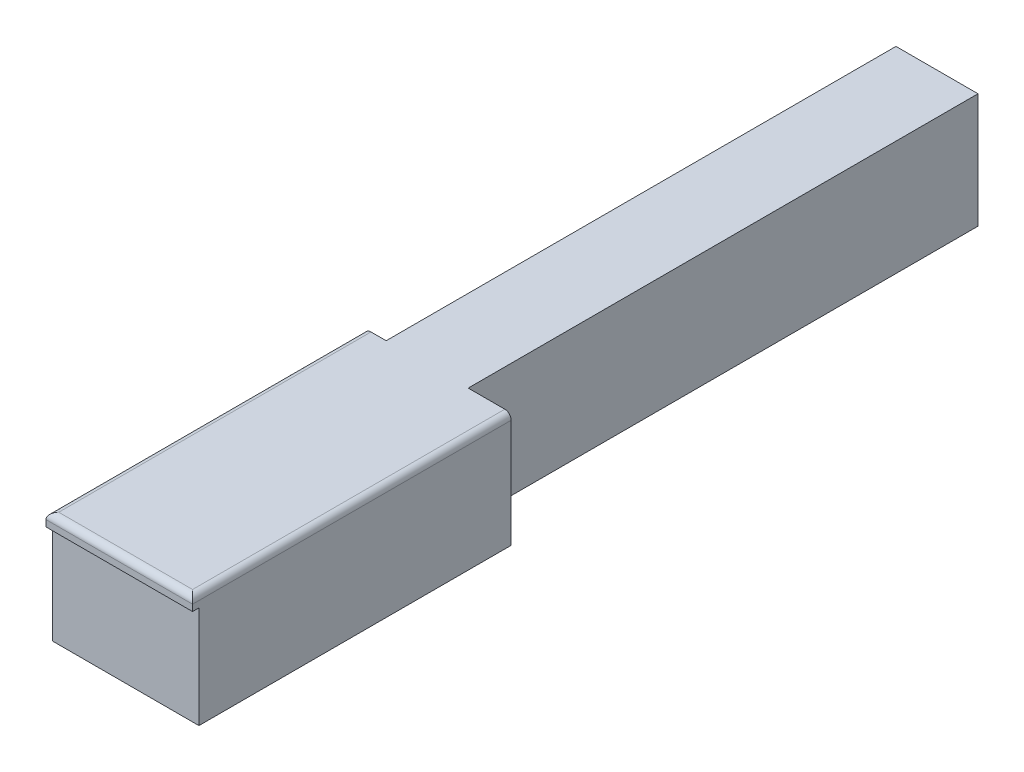
ISO-10303-21;
HEADER;
FILE_DESCRIPTION(('STEP AP214'),'2;1');
FILE_NAME('part.step','',(''),(''),'','','');
FILE_SCHEMA(('AUTOMOTIVE_DESIGN { 1 0 10303 214 1 1 1 1 }'));
ENDSEC;
DATA;
#1=APPLICATION_CONTEXT('core data for automotive mechanical design processes');
#2=APPLICATION_PROTOCOL_DEFINITION('international standard','automotive_design',2000,#1);
#3=PRODUCT_CONTEXT('',#1,'mechanical');
#4=PRODUCT('Part','Part','',(#3));
#5=PRODUCT_RELATED_PRODUCT_CATEGORY('part','',(#4));
#6=PRODUCT_DEFINITION_FORMATION('','',#4);
#7=PRODUCT_DEFINITION_CONTEXT('part definition',#1,'design');
#8=PRODUCT_DEFINITION('design','',#6,#7);
#9=PRODUCT_DEFINITION_SHAPE('','',#8);
#10=(LENGTH_UNIT() NAMED_UNIT(*) SI_UNIT(.MILLI.,.METRE.));
#11=(NAMED_UNIT(*) PLANE_ANGLE_UNIT() SI_UNIT($,.RADIAN.));
#12=(NAMED_UNIT(*) SI_UNIT($,.STERADIAN.) SOLID_ANGLE_UNIT());
#13=UNCERTAINTY_MEASURE_WITH_UNIT(LENGTH_MEASURE(1.E-05),#10,'distance_accuracy_value','');
#14=(GEOMETRIC_REPRESENTATION_CONTEXT(3) GLOBAL_UNCERTAINTY_ASSIGNED_CONTEXT((#13)) GLOBAL_UNIT_ASSIGNED_CONTEXT((#10,
#11,#12)) REPRESENTATION_CONTEXT('',''));
#15=CARTESIAN_POINT('',(0.,0.,0.));
#16=DIRECTION('',(0.,0.,1.));
#17=DIRECTION('',(1.,0.,0.));
#18=AXIS2_PLACEMENT_3D('',#15,#16,#17);
#19=CARTESIAN_POINT('',(0.,18.,-130.));
#20=DIRECTION('',(0.,0.,-1.));
#21=DIRECTION('',(-1.,0.,0.));
#22=AXIS2_PLACEMENT_3D('',#19,#20,#21);
#23=PLANE('',#22);
#24=DIRECTION('',(1.,0.,0.));
#25=VECTOR('',#24,1.);
#26=CARTESIAN_POINT('',(0.,0.,-130.));
#27=LINE('',#26,#25);
#28=CARTESIAN_POINT('',(3.38,0.,-130.));
#29=VERTEX_POINT('',#28);
#30=CARTESIAN_POINT('',(16.255,0.,-130.));
#31=VERTEX_POINT('',#30);
#32=EDGE_CURVE('E216',#29,#31,#27,.T.);
#33=ORIENTED_EDGE('',*,*,#32,.F.);
#34=DIRECTION('',(0.,-1.,0.));
#35=VECTOR('',#34,1.);
#36=CARTESIAN_POINT('',(3.38,18.,-130.));
#37=LINE('',#36,#35);
#38=CARTESIAN_POINT('',(3.38,18.,-130.));
#39=VERTEX_POINT('',#38);
#40=EDGE_CURVE('E181',#39,#29,#37,.T.);
#41=ORIENTED_EDGE('',*,*,#40,.F.);
#42=DIRECTION('',(1.,0.,0.));
#43=VECTOR('',#42,1.);
#44=CARTESIAN_POINT('',(0.,18.,-130.));
#45=LINE('',#44,#43);
#46=CARTESIAN_POINT('',(16.255,18.,-130.));
#47=VERTEX_POINT('',#46);
#48=EDGE_CURVE('E165',#39,#47,#45,.T.);
#49=ORIENTED_EDGE('',*,*,#48,.T.);
#50=DIRECTION('',(0.,-1.,0.));
#51=VECTOR('',#50,1.);
#52=CARTESIAN_POINT('',(16.255,18.,-130.));
#53=LINE('',#52,#51);
#54=EDGE_CURVE('E166',#47,#31,#53,.T.);
#55=ORIENTED_EDGE('',*,*,#54,.T.);
#56=EDGE_LOOP('',(#33,#41,#49,#55));
#57=FACE_BOUND('',#56,.T.);
#58=ADVANCED_FACE('F39',(#57),#23,.T.);
#59=CARTESIAN_POINT('',(3.38000000000002,18.,0.));
#60=DIRECTION('',(1.,0.,0.));
#61=DIRECTION('',(0.,0.,-1.));
#62=AXIS2_PLACEMENT_3D('',#59,#60,#61);
#63=PLANE('',#62);
#64=DIRECTION('',(0.,0.,1.));
#65=VECTOR('',#64,1.);
#66=CARTESIAN_POINT('',(3.38000000000002,0.,0.));
#67=LINE('',#66,#65);
#68=CARTESIAN_POINT('',(3.38000000000001,0.,-50.));
#69=VERTEX_POINT('',#68);
#70=EDGE_CURVE('E231',#29,#69,#67,.T.);
#71=ORIENTED_EDGE('',*,*,#70,.T.);
#72=DIRECTION('',(0.,-1.,0.));
#73=VECTOR('',#72,1.);
#74=CARTESIAN_POINT('',(3.38000000000001,18.,-50.));
#75=LINE('',#74,#73);
#76=CARTESIAN_POINT('',(3.38000000000001,18.,-50.));
#77=VERTEX_POINT('',#76);
#78=EDGE_CURVE('E179',#77,#69,#75,.T.);
#79=ORIENTED_EDGE('',*,*,#78,.F.);
#80=DIRECTION('',(0.,0.,1.));
#81=VECTOR('',#80,1.);
#82=CARTESIAN_POINT('',(3.38000000000002,18.,0.));
#83=LINE('',#82,#81);
#84=EDGE_CURVE('E220',#39,#77,#83,.T.);
#85=ORIENTED_EDGE('',*,*,#84,.F.);
#86=ORIENTED_EDGE('',*,*,#40,.T.);
#87=EDGE_LOOP('',(#71,#79,#85,#86));
#88=FACE_BOUND('',#87,.T.);
#89=ADVANCED_FACE('F244',(#88),#63,.F.);
#90=CARTESIAN_POINT('',(0.,18.,-50.));
#91=DIRECTION('',(0.,0.,-1.));
#92=DIRECTION('',(-1.,0.,0.));
#93=AXIS2_PLACEMENT_3D('',#90,#91,#92);
#94=PLANE('',#93);
#95=DIRECTION('',(0.,-1.,0.));
#96=VECTOR('',#95,1.);
#97=CARTESIAN_POINT('',(0.,18.,-50.));
#98=LINE('',#97,#96);
#99=CARTESIAN_POINT('',(0.,17.,-50.));
#100=VERTEX_POINT('',#99);
#101=CARTESIAN_POINT('',(0.,0.,-50.));
#102=VERTEX_POINT('',#101);
#103=EDGE_CURVE('E177',#100,#102,#98,.T.);
#104=ORIENTED_EDGE('',*,*,#103,.F.);
#105=CARTESIAN_POINT('',(0.999999999999989,17.,-50.));
#106=DIRECTION('',(0.,0.,-1.));
#107=DIRECTION('',(-1.,0.,0.));
#108=AXIS2_PLACEMENT_3D('',#105,#106,#107);
#109=CIRCLE('',#108,1.);
#110=CARTESIAN_POINT('',(0.999999999999989,18.,-50.));
#111=VERTEX_POINT('',#110);
#112=EDGE_CURVE('E48',#100,#111,#109,.T.);
#113=ORIENTED_EDGE('',*,*,#112,.T.);
#114=DIRECTION('',(1.,0.,0.));
#115=VECTOR('',#114,1.);
#116=CARTESIAN_POINT('',(0.,18.,-50.));
#117=LINE('',#116,#115);
#118=EDGE_CURVE('E223',#111,#77,#117,.T.);
#119=ORIENTED_EDGE('',*,*,#118,.T.);
#120=ORIENTED_EDGE('',*,*,#78,.T.);
#121=DIRECTION('',(1.,0.,0.));
#122=VECTOR('',#121,1.);
#123=CARTESIAN_POINT('',(0.,0.,-50.));
#124=LINE('',#123,#122);
#125=EDGE_CURVE('E160',#102,#69,#124,.T.);
#126=ORIENTED_EDGE('',*,*,#125,.F.);
#127=EDGE_LOOP('',(#104,#113,#119,#120,#126));
#128=FACE_BOUND('',#127,.T.);
#129=ADVANCED_FACE('F238',(#128),#94,.T.);
#130=CARTESIAN_POINT('',(0.,18.,0.));
#131=DIRECTION('',(-1.,0.,0.));
#132=DIRECTION('',(0.,0.,1.));
#133=AXIS2_PLACEMENT_3D('',#130,#131,#132);
#134=PLANE('',#133);
#135=DIRECTION('',(0.,-1.,0.));
#136=VECTOR('',#135,1.);
#137=CARTESIAN_POINT('',(0.,18.,0.));
#138=LINE('',#137,#136);
#139=CARTESIAN_POINT('',(0.,17.,0.));
#140=VERTEX_POINT('',#139);
#141=CARTESIAN_POINT('',(0.,16.,0.));
#142=VERTEX_POINT('',#141);
#143=EDGE_CURVE('E175',#140,#142,#138,.T.);
#144=ORIENTED_EDGE('',*,*,#143,.F.);
#145=DIRECTION('',(0.,0.,-1.));
#146=VECTOR('',#145,1.);
#147=CARTESIAN_POINT('',(0.,17.,0.));
#148=LINE('',#147,#146);
#149=EDGE_CURVE('E56',#140,#100,#148,.T.);
#150=ORIENTED_EDGE('',*,*,#149,.T.);
#151=ORIENTED_EDGE('',*,*,#103,.T.);
#152=DIRECTION('',(0.,0.,-1.));
#153=VECTOR('',#152,1.);
#154=CARTESIAN_POINT('',(0.,0.,0.));
#155=LINE('',#154,#153);
#156=CARTESIAN_POINT('',(0.,0.,-1.));
#157=VERTEX_POINT('',#156);
#158=EDGE_CURVE('E156',#157,#102,#155,.T.);
#159=ORIENTED_EDGE('',*,*,#158,.F.);
#160=DIRECTION('',(0.,-1.,0.));
#161=VECTOR('',#160,1.);
#162=CARTESIAN_POINT('',(0.,0.,-1.));
#163=LINE('',#162,#161);
#164=CARTESIAN_POINT('',(0.,16.,-1.));
#165=VERTEX_POINT('',#164);
#166=EDGE_CURVE('E135',#165,#157,#163,.T.);
#167=ORIENTED_EDGE('',*,*,#166,.F.);
#168=DIRECTION('',(0.,0.,1.));
#169=VECTOR('',#168,1.);
#170=CARTESIAN_POINT('',(0.,16.,-1.));
#171=LINE('',#170,#169);
#172=EDGE_CURVE('E214',#165,#142,#171,.T.);
#173=ORIENTED_EDGE('',*,*,#172,.T.);
#174=EDGE_LOOP('',(#144,#150,#151,#159,#167,#173));
#175=FACE_BOUND('',#174,.T.);
#176=ADVANCED_FACE('F276',(#175),#134,.T.);
#177=CARTESIAN_POINT('',(0.,18.,0.));
#178=DIRECTION('',(0.,0.,-1.));
#179=DIRECTION('',(-1.,0.,0.));
#180=AXIS2_PLACEMENT_3D('',#177,#178,#179);
#181=PLANE('',#180);
#182=DIRECTION('',(0.,-1.,0.));
#183=VECTOR('',#182,1.);
#184=CARTESIAN_POINT('',(23.,18.,0.));
#185=LINE('',#184,#183);
#186=CARTESIAN_POINT('',(23.,17.,0.));
#187=VERTEX_POINT('',#186);
#188=CARTESIAN_POINT('',(23.,16.,0.));
#189=VERTEX_POINT('',#188);
#190=EDGE_CURVE('E173',#187,#189,#185,.T.);
#191=ORIENTED_EDGE('',*,*,#190,.F.);
#192=DIRECTION('',(1.,0.,0.));
#193=VECTOR('',#192,1.);
#194=CARTESIAN_POINT('',(0.,17.,0.));
#195=LINE('',#194,#193);
#196=EDGE_CURVE('E11',#187,#140,#195,.F.);
#197=ORIENTED_EDGE('',*,*,#196,.T.);
#198=ORIENTED_EDGE('',*,*,#143,.T.);
#199=DIRECTION('',(-1.,0.,0.));
#200=VECTOR('',#199,1.);
#201=CARTESIAN_POINT('',(0.,16.,0.));
#202=LINE('',#201,#200);
#203=EDGE_CURVE('E202',#189,#142,#202,.T.);
#204=ORIENTED_EDGE('',*,*,#203,.F.);
#205=EDGE_LOOP('',(#191,#197,#198,#204));
#206=FACE_BOUND('',#205,.T.);
#207=ADVANCED_FACE('F279',(#206),#181,.F.);
#208=CARTESIAN_POINT('',(23.,18.,0.));
#209=DIRECTION('',(-1.,0.,0.));
#210=DIRECTION('',(0.,0.,1.));
#211=AXIS2_PLACEMENT_3D('',#208,#209,#210);
#212=PLANE('',#211);
#213=DIRECTION('',(0.,-1.,0.));
#214=VECTOR('',#213,1.);
#215=CARTESIAN_POINT('',(23.,18.,-50.));
#216=LINE('',#215,#214);
#217=CARTESIAN_POINT('',(23.,17.,-50.));
#218=VERTEX_POINT('',#217);
#219=CARTESIAN_POINT('',(23.,0.,-50.));
#220=VERTEX_POINT('',#219);
#221=EDGE_CURVE('E171',#218,#220,#216,.T.);
#222=ORIENTED_EDGE('',*,*,#221,.F.);
#223=DIRECTION('',(0.,0.,-1.));
#224=VECTOR('',#223,1.);
#225=CARTESIAN_POINT('',(23.,17.,0.));
#226=LINE('',#225,#224);
#227=EDGE_CURVE('E192',#218,#187,#226,.F.);
#228=ORIENTED_EDGE('',*,*,#227,.T.);
#229=ORIENTED_EDGE('',*,*,#190,.T.);
#230=DIRECTION('',(0.,0.,1.));
#231=VECTOR('',#230,1.);
#232=CARTESIAN_POINT('',(23.,16.,-1.));
#233=LINE('',#232,#231);
#234=CARTESIAN_POINT('',(23.,16.,-1.));
#235=VERTEX_POINT('',#234);
#236=EDGE_CURVE('E149',#235,#189,#233,.T.);
#237=ORIENTED_EDGE('',*,*,#236,.F.);
#238=DIRECTION('',(0.,1.,0.));
#239=VECTOR('',#238,1.);
#240=CARTESIAN_POINT('',(23.,0.,-1.));
#241=LINE('',#240,#239);
#242=CARTESIAN_POINT('',(23.,0.,-1.));
#243=VERTEX_POINT('',#242);
#244=EDGE_CURVE('E132',#243,#235,#241,.T.);
#245=ORIENTED_EDGE('',*,*,#244,.F.);
#246=DIRECTION('',(0.,0.,-1.));
#247=VECTOR('',#246,1.);
#248=CARTESIAN_POINT('',(23.,0.,0.));
#249=LINE('',#248,#247);
#250=EDGE_CURVE('E146',#243,#220,#249,.T.);
#251=ORIENTED_EDGE('',*,*,#250,.T.);
#252=EDGE_LOOP('',(#222,#228,#229,#237,#245,#251));
#253=FACE_BOUND('',#252,.T.);
#254=ADVANCED_FACE('F145',(#253),#212,.F.);
#255=CARTESIAN_POINT('',(0.,18.,-50.));
#256=DIRECTION('',(0.,0.,1.));
#257=DIRECTION('',(1.,0.,0.));
#258=AXIS2_PLACEMENT_3D('',#255,#256,#257);
#259=PLANE('',#258);
#260=DIRECTION('',(-1.,0.,0.));
#261=VECTOR('',#260,1.);
#262=CARTESIAN_POINT('',(0.,18.,-50.));
#263=LINE('',#262,#261);
#264=CARTESIAN_POINT('',(22.,18.,-50.));
#265=VERTEX_POINT('',#264);
#266=CARTESIAN_POINT('',(16.255,18.,-50.));
#267=VERTEX_POINT('',#266);
#268=EDGE_CURVE('E225',#265,#267,#263,.T.);
#269=ORIENTED_EDGE('',*,*,#268,.F.);
#270=CARTESIAN_POINT('',(22.,17.,-50.));
#271=DIRECTION('',(0.,0.,1.));
#272=DIRECTION('',(1.,0.,0.));
#273=AXIS2_PLACEMENT_3D('',#270,#271,#272);
#274=CIRCLE('',#273,1.);
#275=EDGE_CURVE('E190',#265,#218,#274,.F.);
#276=ORIENTED_EDGE('',*,*,#275,.T.);
#277=ORIENTED_EDGE('',*,*,#221,.T.);
#278=DIRECTION('',(-1.,0.,0.));
#279=VECTOR('',#278,1.);
#280=CARTESIAN_POINT('',(0.,0.,-50.));
#281=LINE('',#280,#279);
#282=CARTESIAN_POINT('',(16.255,0.,-50.));
#283=VERTEX_POINT('',#282);
#284=EDGE_CURVE('E155',#220,#283,#281,.T.);
#285=ORIENTED_EDGE('',*,*,#284,.T.);
#286=DIRECTION('',(0.,-1.,0.));
#287=VECTOR('',#286,1.);
#288=CARTESIAN_POINT('',(16.255,18.,-50.));
#289=LINE('',#288,#287);
#290=EDGE_CURVE('E168',#267,#283,#289,.T.);
#291=ORIENTED_EDGE('',*,*,#290,.F.);
#292=EDGE_LOOP('',(#269,#276,#277,#285,#291));
#293=FACE_BOUND('',#292,.T.);
#294=ADVANCED_FACE('F254',(#293),#259,.F.);
#295=CARTESIAN_POINT('',(16.255,18.,0.));
#296=DIRECTION('',(1.,0.,0.));
#297=DIRECTION('',(0.,0.,-1.));
#298=AXIS2_PLACEMENT_3D('',#295,#296,#297);
#299=PLANE('',#298);
#300=DIRECTION('',(0.,0.,1.));
#301=VECTOR('',#300,1.);
#302=CARTESIAN_POINT('',(16.255,0.,0.));
#303=LINE('',#302,#301);
#304=EDGE_CURVE('E158',#31,#283,#303,.T.);
#305=ORIENTED_EDGE('',*,*,#304,.F.);
#306=ORIENTED_EDGE('',*,*,#54,.F.);
#307=DIRECTION('',(0.,0.,1.));
#308=VECTOR('',#307,1.);
#309=CARTESIAN_POINT('',(16.255,18.,0.));
#310=LINE('',#309,#308);
#311=EDGE_CURVE('E169',#47,#267,#310,.T.);
#312=ORIENTED_EDGE('',*,*,#311,.T.);
#313=ORIENTED_EDGE('',*,*,#290,.T.);
#314=EDGE_LOOP('',(#305,#306,#312,#313));
#315=FACE_BOUND('',#314,.T.);
#316=ADVANCED_FACE('F250',(#315),#299,.T.);
#317=CARTESIAN_POINT('',(0.,18.,0.));
#318=DIRECTION('',(0.,1.,0.));
#319=DIRECTION('',(0.,0.,1.));
#320=AXIS2_PLACEMENT_3D('',#317,#318,#319);
#321=PLANE('',#320);
#322=DIRECTION('',(1.,0.,0.));
#323=VECTOR('',#322,1.);
#324=CARTESIAN_POINT('',(23.,18.,-1.));
#325=LINE('',#324,#323);
#326=CARTESIAN_POINT('',(1.,18.,-1.));
#327=VERTEX_POINT('',#326);
#328=CARTESIAN_POINT('',(22.,18.,-1.));
#329=VERTEX_POINT('',#328);
#330=EDGE_CURVE('E183',#327,#329,#325,.T.);
#331=ORIENTED_EDGE('',*,*,#330,.T.);
#332=DIRECTION('',(0.,0.,-1.));
#333=VECTOR('',#332,1.);
#334=CARTESIAN_POINT('',(22.,18.,-50.));
#335=LINE('',#334,#333);
#336=EDGE_CURVE('E187',#329,#265,#335,.T.);
#337=ORIENTED_EDGE('',*,*,#336,.T.);
#338=ORIENTED_EDGE('',*,*,#268,.T.);
#339=ORIENTED_EDGE('',*,*,#311,.F.);
#340=ORIENTED_EDGE('',*,*,#48,.F.);
#341=ORIENTED_EDGE('',*,*,#84,.T.);
#342=ORIENTED_EDGE('',*,*,#118,.F.);
#343=DIRECTION('',(0.,0.,-1.));
#344=VECTOR('',#343,1.);
#345=CARTESIAN_POINT('',(1.,18.,0.));
#346=LINE('',#345,#344);
#347=EDGE_CURVE('E185',#111,#327,#346,.F.);
#348=ORIENTED_EDGE('',*,*,#347,.T.);
#349=EDGE_LOOP('',(#331,#337,#338,#339,#340,#341,#342,#348));
#350=FACE_BOUND('',#349,.T.);
#351=ADVANCED_FACE('F257',(#350),#321,.T.);
#352=CARTESIAN_POINT('',(0.,0.,0.));
#353=DIRECTION('',(0.,1.,0.));
#354=DIRECTION('',(0.,0.,1.));
#355=AXIS2_PLACEMENT_3D('',#352,#353,#354);
#356=PLANE('',#355);
#357=ORIENTED_EDGE('',*,*,#250,.F.);
#358=DIRECTION('',(1.,0.,0.));
#359=VECTOR('',#358,1.);
#360=CARTESIAN_POINT('',(0.,0.,-1.));
#361=LINE('',#360,#359);
#362=EDGE_CURVE('E128',#157,#243,#361,.T.);
#363=ORIENTED_EDGE('',*,*,#362,.F.);
#364=ORIENTED_EDGE('',*,*,#158,.T.);
#365=ORIENTED_EDGE('',*,*,#125,.T.);
#366=ORIENTED_EDGE('',*,*,#70,.F.);
#367=ORIENTED_EDGE('',*,*,#32,.T.);
#368=ORIENTED_EDGE('',*,*,#304,.T.);
#369=ORIENTED_EDGE('',*,*,#284,.F.);
#370=EDGE_LOOP('',(#357,#363,#364,#365,#366,#367,#368,#369));
#371=FACE_BOUND('',#370,.T.);
#372=ADVANCED_FACE('F152',(#371),#356,.F.);
#373=CARTESIAN_POINT('',(0.,16.,-1.));
#374=DIRECTION('',(0.,1.,0.));
#375=DIRECTION('',(0.,0.,1.));
#376=AXIS2_PLACEMENT_3D('',#373,#374,#375);
#377=PLANE('',#376);
#378=ORIENTED_EDGE('',*,*,#203,.T.);
#379=ORIENTED_EDGE('',*,*,#172,.F.);
#380=DIRECTION('',(-1.,0.,0.));
#381=VECTOR('',#380,1.);
#382=CARTESIAN_POINT('',(0.,16.,-1.));
#383=LINE('',#382,#381);
#384=EDGE_CURVE('E150',#235,#165,#383,.T.);
#385=ORIENTED_EDGE('',*,*,#384,.F.);
#386=ORIENTED_EDGE('',*,*,#236,.T.);
#387=EDGE_LOOP('',(#378,#379,#385,#386));
#388=FACE_BOUND('',#387,.T.);
#389=ADVANCED_FACE('F290',(#388),#377,.F.);
#390=CARTESIAN_POINT('',(0.,0.,-1.));
#391=DIRECTION('',(0.,0.,-1.));
#392=DIRECTION('',(-1.,0.,0.));
#393=AXIS2_PLACEMENT_3D('',#390,#391,#392);
#394=PLANE('',#393);
#395=ORIENTED_EDGE('',*,*,#166,.T.);
#396=ORIENTED_EDGE('',*,*,#362,.T.);
#397=ORIENTED_EDGE('',*,*,#244,.T.);
#398=ORIENTED_EDGE('',*,*,#384,.T.);
#399=EDGE_LOOP('',(#395,#396,#397,#398));
#400=FACE_BOUND('',#399,.T.);
#401=ADVANCED_FACE('F130',(#400),#394,.F.);
#402=CARTESIAN_POINT('',(1.,17.,0.));
#403=DIRECTION('',(0.,0.,-1.));
#404=DIRECTION('',(-1.,0.,0.));
#405=AXIS2_PLACEMENT_3D('',#402,#403,#404);
#406=CYLINDRICAL_SURFACE('',#405,1.);
#407=ORIENTED_EDGE('',*,*,#112,.F.);
#408=ORIENTED_EDGE('',*,*,#149,.F.);
#409=CARTESIAN_POINT('',(1.,17.,-1.));
#410=DIRECTION('',(-0.707106781186548,0.,-0.707106781186547));
#411=DIRECTION('',(-0.707106781186547,0.,0.707106781186548));
#412=AXIS2_PLACEMENT_3D('',#409,#410,#411);
#413=ELLIPSE('',#412,1.41421356237309,1.);
#414=EDGE_CURVE('E43',#327,#140,#413,.F.);
#415=ORIENTED_EDGE('',*,*,#414,.F.);
#416=ORIENTED_EDGE('',*,*,#347,.F.);
#417=EDGE_LOOP('',(#407,#408,#415,#416));
#418=FACE_BOUND('',#417,.T.);
#419=ADVANCED_FACE('F41',(#418),#406,.T.);
#420=CARTESIAN_POINT('',(0.,17.,-1.));
#421=DIRECTION('',(-1.,0.,0.));
#422=DIRECTION('',(0.,0.,1.));
#423=AXIS2_PLACEMENT_3D('',#420,#421,#422);
#424=CYLINDRICAL_SURFACE('',#423,1.);
#425=ORIENTED_EDGE('',*,*,#414,.T.);
#426=ORIENTED_EDGE('',*,*,#196,.F.);
#427=CARTESIAN_POINT('',(22.,17.,-1.));
#428=DIRECTION('',(-0.707106781186547,0.,0.707106781186548));
#429=DIRECTION('',(-0.707106781186548,0.,-0.707106781186547));
#430=AXIS2_PLACEMENT_3D('',#427,#428,#429);
#431=ELLIPSE('',#430,1.4142135623731,1.);
#432=EDGE_CURVE('E195',#329,#187,#431,.F.);
#433=ORIENTED_EDGE('',*,*,#432,.F.);
#434=ORIENTED_EDGE('',*,*,#330,.F.);
#435=EDGE_LOOP('',(#425,#426,#433,#434));
#436=FACE_BOUND('',#435,.T.);
#437=ADVANCED_FACE('F259',(#436),#424,.T.);
#438=CARTESIAN_POINT('',(22.,17.,0.));
#439=DIRECTION('',(0.,0.,1.));
#440=DIRECTION('',(1.,0.,0.));
#441=AXIS2_PLACEMENT_3D('',#438,#439,#440);
#442=CYLINDRICAL_SURFACE('',#441,1.);
#443=ORIENTED_EDGE('',*,*,#432,.T.);
#444=ORIENTED_EDGE('',*,*,#227,.F.);
#445=ORIENTED_EDGE('',*,*,#275,.F.);
#446=ORIENTED_EDGE('',*,*,#336,.F.);
#447=EDGE_LOOP('',(#443,#444,#445,#446));
#448=FACE_BOUND('',#447,.T.);
#449=ADVANCED_FACE('F255',(#448),#442,.T.);
#450=CLOSED_SHELL('',(#58,#89,#129,#176,#207,#254,#294,#316,#351,#372,#389,#401,#419,#437,#449));
#451=MANIFOLD_SOLID_BREP('B2',#450);
#452=ADVANCED_BREP_SHAPE_REPRESENTATION('',(#18,#451),#14);
#453=SHAPE_DEFINITION_REPRESENTATION(#9,#452);
ENDSEC;
END-ISO-10303-21;
